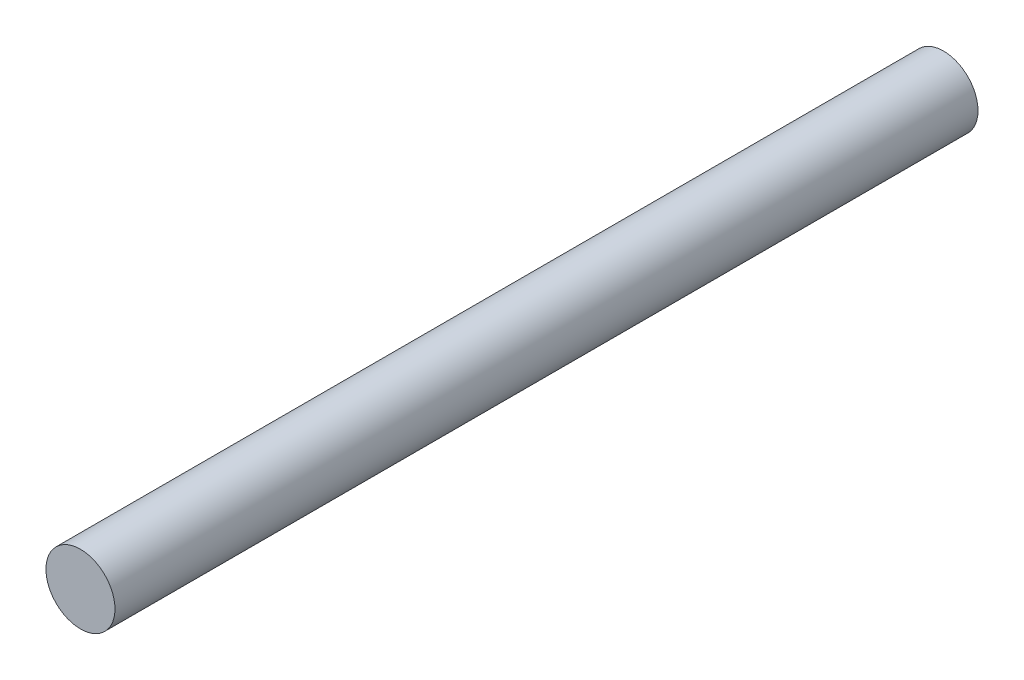
ISO-10303-21;
HEADER;
FILE_DESCRIPTION(('STEP AP214'),'2;1');
FILE_NAME('part.step','',(''),(''),'','','');
FILE_SCHEMA(('AUTOMOTIVE_DESIGN { 1 0 10303 214 1 1 1 1 }'));
ENDSEC;
DATA;
#1=APPLICATION_CONTEXT('core data for automotive mechanical design processes');
#2=APPLICATION_PROTOCOL_DEFINITION('international standard','automotive_design',2000,#1);
#3=PRODUCT_CONTEXT('',#1,'mechanical');
#4=PRODUCT('Part','Part','',(#3));
#5=PRODUCT_RELATED_PRODUCT_CATEGORY('part','',(#4));
#6=PRODUCT_DEFINITION_FORMATION('','',#4);
#7=PRODUCT_DEFINITION_CONTEXT('part definition',#1,'design');
#8=PRODUCT_DEFINITION('design','',#6,#7);
#9=PRODUCT_DEFINITION_SHAPE('','',#8);
#10=(LENGTH_UNIT() NAMED_UNIT(*) SI_UNIT(.MILLI.,.METRE.));
#11=(NAMED_UNIT(*) PLANE_ANGLE_UNIT() SI_UNIT($,.RADIAN.));
#12=(NAMED_UNIT(*) SI_UNIT($,.STERADIAN.) SOLID_ANGLE_UNIT());
#13=UNCERTAINTY_MEASURE_WITH_UNIT(LENGTH_MEASURE(1.E-05),#10,'distance_accuracy_value','');
#14=(GEOMETRIC_REPRESENTATION_CONTEXT(3) GLOBAL_UNCERTAINTY_ASSIGNED_CONTEXT((#13)) GLOBAL_UNIT_ASSIGNED_CONTEXT((#10,
#11,#12)) REPRESENTATION_CONTEXT('',''));
#15=CARTESIAN_POINT('',(0.,0.,0.));
#16=DIRECTION('',(0.,0.,1.));
#17=DIRECTION('',(1.,0.,0.));
#18=AXIS2_PLACEMENT_3D('',#15,#16,#17);
#19=CARTESIAN_POINT('',(-171.600500868498,12.4999999999999,-25.));
#20=DIRECTION('',(0.,0.,1.));
#21=DIRECTION('',(1.,0.,0.));
#22=AXIS2_PLACEMENT_3D('',#19,#20,#21);
#23=CYLINDRICAL_SURFACE('',#22,4.19999999999998);
#24=CARTESIAN_POINT('',(-171.600500868498,12.4999999999999,-25.));
#25=DIRECTION('',(0.,0.,1.));
#26=DIRECTION('',(1.,0.,0.));
#27=AXIS2_PLACEMENT_3D('',#24,#25,#26);
#28=CIRCLE('',#27,4.19999999999998);
#29=CARTESIAN_POINT('',(-167.400500868498,12.4999999999999,-25.));
#30=VERTEX_POINT('',#29);
#31=EDGE_CURVE('E10',#30,#30,#28,.T.);
#32=ORIENTED_EDGE('',*,*,#31,.T.);
#33=EDGE_LOOP('',(#32));
#34=FACE_BOUND('',#33,.T.);
#35=CARTESIAN_POINT('',(-171.600500868498,12.4999999999999,80.));
#36=DIRECTION('',(0.,0.,1.));
#37=DIRECTION('',(1.,0.,0.));
#38=AXIS2_PLACEMENT_3D('',#35,#36,#37);
#39=CIRCLE('',#38,4.19999999999998);
#40=CARTESIAN_POINT('',(-167.400500868498,12.4999999999999,80.));
#41=VERTEX_POINT('',#40);
#42=EDGE_CURVE('E34',#41,#41,#39,.T.);
#43=ORIENTED_EDGE('',*,*,#42,.F.);
#44=EDGE_LOOP('',(#43));
#45=FACE_BOUND('',#44,.T.);
#46=ADVANCED_FACE('F28',(#34,#45),#23,.T.);
#47=CARTESIAN_POINT('',(-171.600500868498,12.4999999999999,-25.));
#48=DIRECTION('',(0.,0.,1.));
#49=DIRECTION('',(1.,0.,0.));
#50=AXIS2_PLACEMENT_3D('',#47,#48,#49);
#51=PLANE('',#50);
#52=ORIENTED_EDGE('',*,*,#31,.F.);
#53=EDGE_LOOP('',(#52));
#54=FACE_BOUND('',#53,.T.);
#55=ADVANCED_FACE('F43',(#54),#51,.F.);
#56=CARTESIAN_POINT('',(-171.600500868498,12.4999999999999,80.));
#57=DIRECTION('',(0.,0.,1.));
#58=DIRECTION('',(1.,0.,0.));
#59=AXIS2_PLACEMENT_3D('',#56,#57,#58);
#60=PLANE('',#59);
#61=ORIENTED_EDGE('',*,*,#42,.T.);
#62=EDGE_LOOP('',(#61));
#63=FACE_BOUND('',#62,.T.);
#64=ADVANCED_FACE('F40',(#63),#60,.T.);
#65=CLOSED_SHELL('',(#46,#55,#64));
#66=MANIFOLD_SOLID_BREP('B2',#65);
#67=ADVANCED_BREP_SHAPE_REPRESENTATION('',(#18,#66),#14);
#68=SHAPE_DEFINITION_REPRESENTATION(#9,#67);
ENDSEC;
END-ISO-10303-21;
